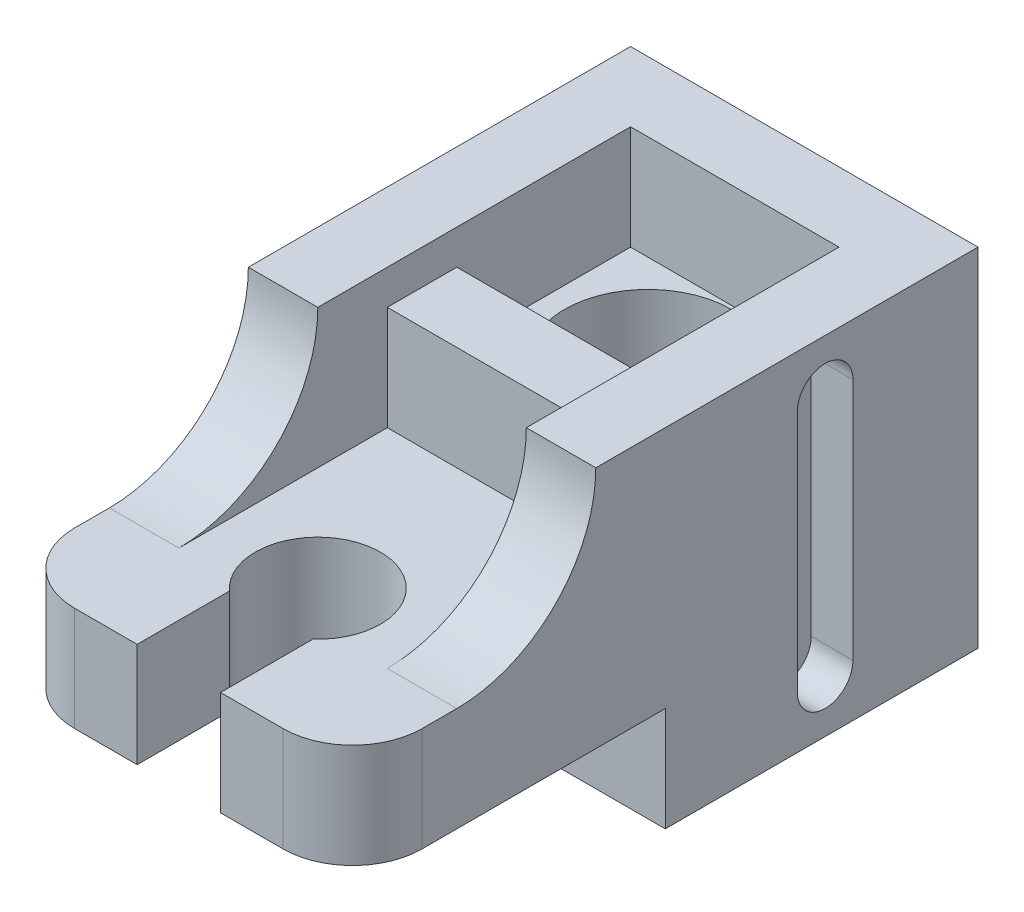
ISO-10303-21;
HEADER;
FILE_DESCRIPTION(('STEP AP214'),'2;1');
FILE_NAME('part.step','',(''),(''),'','','');
FILE_SCHEMA(('AUTOMOTIVE_DESIGN { 1 0 10303 214 1 1 1 1 }'));
ENDSEC;
DATA;
#1=APPLICATION_CONTEXT('core data for automotive mechanical design processes');
#2=APPLICATION_PROTOCOL_DEFINITION('international standard','automotive_design',2000,#1);
#3=PRODUCT_CONTEXT('',#1,'mechanical');
#4=PRODUCT('Part','Part','',(#3));
#5=PRODUCT_RELATED_PRODUCT_CATEGORY('part','',(#4));
#6=PRODUCT_DEFINITION_FORMATION('','',#4);
#7=PRODUCT_DEFINITION_CONTEXT('part definition',#1,'design');
#8=PRODUCT_DEFINITION('design','',#6,#7);
#9=PRODUCT_DEFINITION_SHAPE('','',#8);
#10=(LENGTH_UNIT() NAMED_UNIT(*) SI_UNIT(.MILLI.,.METRE.));
#11=(NAMED_UNIT(*) PLANE_ANGLE_UNIT() SI_UNIT($,.RADIAN.));
#12=(NAMED_UNIT(*) SI_UNIT($,.STERADIAN.) SOLID_ANGLE_UNIT());
#13=UNCERTAINTY_MEASURE_WITH_UNIT(LENGTH_MEASURE(1.E-05),#10,'distance_accuracy_value','');
#14=(GEOMETRIC_REPRESENTATION_CONTEXT(3) GLOBAL_UNCERTAINTY_ASSIGNED_CONTEXT((#13)) GLOBAL_UNIT_ASSIGNED_CONTEXT((#10,
#11,#12)) REPRESENTATION_CONTEXT('',''));
#15=CARTESIAN_POINT('',(0.,0.,0.));
#16=DIRECTION('',(0.,0.,1.));
#17=DIRECTION('',(1.,0.,0.));
#18=AXIS2_PLACEMENT_3D('',#15,#16,#17);
#19=CARTESIAN_POINT('',(-25.,50.,30.));
#20=DIRECTION('',(-1.,0.,0.));
#21=DIRECTION('',(0.,0.,1.));
#22=AXIS2_PLACEMENT_3D('',#19,#20,#21);
#23=PLANE('',#22);
#24=DIRECTION('',(0.,0.,-1.));
#25=VECTOR('',#24,1.);
#26=CARTESIAN_POINT('',(-25.,15.,45.));
#27=LINE('',#26,#25);
#28=CARTESIAN_POINT('',(-25.,15.,35.));
#29=VERTEX_POINT('',#28);
#30=CARTESIAN_POINT('',(-25.,15.,0.));
#31=VERTEX_POINT('',#30);
#32=EDGE_CURVE('E395',#29,#31,#27,.T.);
#33=ORIENTED_EDGE('',*,*,#32,.F.);
#34=DIRECTION('',(0.,-1.,0.));
#35=VECTOR('',#34,1.);
#36=CARTESIAN_POINT('',(-25.,30.,35.));
#37=LINE('',#36,#35);
#38=CARTESIAN_POINT('',(-25.,30.,35.));
#39=VERTEX_POINT('',#38);
#40=EDGE_CURVE('E11',#29,#39,#37,.F.);
#41=ORIENTED_EDGE('',*,*,#40,.T.);
#42=DIRECTION('',(0.,0.,1.));
#43=VECTOR('',#42,1.);
#44=CARTESIAN_POINT('',(-25.,30.,30.));
#45=LINE('',#44,#43);
#46=CARTESIAN_POINT('',(-25.,30.,30.));
#47=VERTEX_POINT('',#46);
#48=EDGE_CURVE('E421',#47,#39,#45,.T.);
#49=ORIENTED_EDGE('',*,*,#48,.F.);
#50=CARTESIAN_POINT('',(-25.,50.,30.));
#51=DIRECTION('',(-1.,0.,0.));
#52=DIRECTION('',(0.,0.,1.));
#53=AXIS2_PLACEMENT_3D('',#50,#51,#52);
#54=CIRCLE('',#53,20.);
#55=CARTESIAN_POINT('',(-25.,50.,10.));
#56=VERTEX_POINT('',#55);
#57=EDGE_CURVE('E418',#56,#47,#54,.T.);
#58=ORIENTED_EDGE('',*,*,#57,.F.);
#59=DIRECTION('',(0.,0.,1.));
#60=VECTOR('',#59,1.);
#61=CARTESIAN_POINT('',(-25.,50.,-45.));
#62=LINE('',#61,#60);
#63=CARTESIAN_POINT('',(-25.,50.,-45.));
#64=VERTEX_POINT('',#63);
#65=EDGE_CURVE('E415',#64,#56,#62,.T.);
#66=ORIENTED_EDGE('',*,*,#65,.F.);
#67=DIRECTION('',(0.,1.,0.));
#68=VECTOR('',#67,1.);
#69=CARTESIAN_POINT('',(-25.,0.,-45.));
#70=LINE('',#69,#68);
#71=CARTESIAN_POINT('',(-25.,0.,-45.));
#72=VERTEX_POINT('',#71);
#73=EDGE_CURVE('E413',#72,#64,#70,.T.);
#74=ORIENTED_EDGE('',*,*,#73,.F.);
#75=DIRECTION('',(0.,0.,-1.));
#76=VECTOR('',#75,1.);
#77=CARTESIAN_POINT('',(-25.,0.,0.));
#78=LINE('',#77,#76);
#79=CARTESIAN_POINT('',(-25.,0.,0.));
#80=VERTEX_POINT('',#79);
#81=EDGE_CURVE('E411',#80,#72,#78,.T.);
#82=ORIENTED_EDGE('',*,*,#81,.F.);
#83=DIRECTION('',(0.,-1.,0.));
#84=VECTOR('',#83,1.);
#85=CARTESIAN_POINT('',(-25.,15.,0.));
#86=LINE('',#85,#84);
#87=EDGE_CURVE('E381',#31,#80,#86,.T.);
#88=ORIENTED_EDGE('',*,*,#87,.F.);
#89=EDGE_LOOP('',(#33,#41,#49,#58,#66,#74,#82,#88));
#90=FACE_BOUND('',#89,.T.);
#91=DIRECTION('',(0.,1.,0.));
#92=VECTOR('',#91,1.);
#93=CARTESIAN_POINT('',(-25.,42.5,-27.));
#94=LINE('',#93,#92);
#95=CARTESIAN_POINT('',(-25.,7.5,-27.));
#96=VERTEX_POINT('',#95);
#97=CARTESIAN_POINT('',(-25.,42.5,-27.));
#98=VERTEX_POINT('',#97);
#99=EDGE_CURVE('E268',#96,#98,#94,.T.);
#100=ORIENTED_EDGE('',*,*,#99,.T.);
#101=CARTESIAN_POINT('',(-25.,42.5,-23.));
#102=DIRECTION('',(1.,0.,0.));
#103=DIRECTION('',(0.,0.,-1.));
#104=AXIS2_PLACEMENT_3D('',#101,#102,#103);
#105=CIRCLE('',#104,4.00000000000001);
#106=CARTESIAN_POINT('',(-25.,42.5,-19.));
#107=VERTEX_POINT('',#106);
#108=EDGE_CURVE('E255',#98,#107,#105,.T.);
#109=ORIENTED_EDGE('',*,*,#108,.T.);
#110=DIRECTION('',(0.,-1.,0.));
#111=VECTOR('',#110,1.);
#112=CARTESIAN_POINT('',(-25.,42.5,-19.));
#113=LINE('',#112,#111);
#114=CARTESIAN_POINT('',(-25.,7.5,-19.));
#115=VERTEX_POINT('',#114);
#116=EDGE_CURVE('E259',#107,#115,#113,.T.);
#117=ORIENTED_EDGE('',*,*,#116,.T.);
#118=CARTESIAN_POINT('',(-25.,7.5,-23.));
#119=DIRECTION('',(1.,0.,0.));
#120=DIRECTION('',(0.,0.,-1.));
#121=AXIS2_PLACEMENT_3D('',#118,#119,#120);
#122=CIRCLE('',#121,4.00000000000001);
#123=EDGE_CURVE('E262',#115,#96,#122,.T.);
#124=ORIENTED_EDGE('',*,*,#123,.T.);
#125=EDGE_LOOP('',(#100,#109,#117,#124));
#126=FACE_BOUND('',#125,.T.);
#127=ADVANCED_FACE('F37',(#90,#126),#23,.T.);
#128=CARTESIAN_POINT('',(25.,30.,45.));
#129=DIRECTION('',(0.,0.,-1.));
#130=DIRECTION('',(-1.,0.,0.));
#131=AXIS2_PLACEMENT_3D('',#128,#129,#130);
#132=PLANE('',#131);
#133=DIRECTION('',(-1.,0.,0.));
#134=VECTOR('',#133,1.);
#135=CARTESIAN_POINT('',(25.,30.,45.));
#136=LINE('',#135,#134);
#137=CARTESIAN_POINT('',(-6.,30.,45.));
#138=VERTEX_POINT('',#137);
#139=CARTESIAN_POINT('',(-15.,30.,45.));
#140=VERTEX_POINT('',#139);
#141=EDGE_CURVE('E429',#138,#140,#136,.T.);
#142=ORIENTED_EDGE('',*,*,#141,.T.);
#143=DIRECTION('',(0.,-1.,0.));
#144=VECTOR('',#143,1.);
#145=CARTESIAN_POINT('',(-15.,15.,45.));
#146=LINE('',#145,#144);
#147=CARTESIAN_POINT('',(-15.,15.,45.));
#148=VERTEX_POINT('',#147);
#149=EDGE_CURVE('E45',#140,#148,#146,.T.);
#150=ORIENTED_EDGE('',*,*,#149,.T.);
#151=DIRECTION('',(-1.,0.,0.));
#152=VECTOR('',#151,1.);
#153=CARTESIAN_POINT('',(25.,15.,45.));
#154=LINE('',#153,#152);
#155=CARTESIAN_POINT('',(-6.,15.,45.));
#156=VERTEX_POINT('',#155);
#157=EDGE_CURVE('E426',#156,#148,#154,.T.);
#158=ORIENTED_EDGE('',*,*,#157,.F.);
#159=DIRECTION('',(0.,-1.,0.));
#160=VECTOR('',#159,1.);
#161=CARTESIAN_POINT('',(-6.,50.,45.));
#162=LINE('',#161,#160);
#163=EDGE_CURVE('E317',#138,#156,#162,.T.);
#164=ORIENTED_EDGE('',*,*,#163,.F.);
#165=EDGE_LOOP('',(#142,#150,#158,#164));
#166=FACE_BOUND('',#165,.T.);
#167=ADVANCED_FACE('F474',(#166),#132,.F.);
#168=CARTESIAN_POINT('',(25.,50.,-45.));
#169=DIRECTION('',(0.,-1.,0.));
#170=DIRECTION('',(0.,0.,-1.));
#171=AXIS2_PLACEMENT_3D('',#168,#169,#170);
#172=PLANE('',#171);
#173=DIRECTION('',(0.,0.,1.));
#174=VECTOR('',#173,1.);
#175=CARTESIAN_POINT('',(-15.,50.,-35.));
#176=LINE('',#175,#174);
#177=CARTESIAN_POINT('',(-15.,50.,-35.));
#178=VERTEX_POINT('',#177);
#179=CARTESIAN_POINT('',(-15.,50.,10.));
#180=VERTEX_POINT('',#179);
#181=EDGE_CURVE('E332',#178,#180,#176,.T.);
#182=ORIENTED_EDGE('',*,*,#181,.F.);
#183=DIRECTION('',(1.,0.,0.));
#184=VECTOR('',#183,1.);
#185=CARTESIAN_POINT('',(-15.,50.,-35.));
#186=LINE('',#185,#184);
#187=CARTESIAN_POINT('',(15.,50.,-35.));
#188=VERTEX_POINT('',#187);
#189=EDGE_CURVE('E378',#178,#188,#186,.T.);
#190=ORIENTED_EDGE('',*,*,#189,.T.);
#191=DIRECTION('',(0.,0.,1.));
#192=VECTOR('',#191,1.);
#193=CARTESIAN_POINT('',(15.,50.,-35.));
#194=LINE('',#193,#192);
#195=CARTESIAN_POINT('',(15.,50.,10.));
#196=VERTEX_POINT('',#195);
#197=EDGE_CURVE('E331',#188,#196,#194,.T.);
#198=ORIENTED_EDGE('',*,*,#197,.T.);
#199=DIRECTION('',(-1.,0.,0.));
#200=VECTOR('',#199,1.);
#201=CARTESIAN_POINT('',(25.,50.,10.));
#202=LINE('',#201,#200);
#203=CARTESIAN_POINT('',(25.,50.,10.));
#204=VERTEX_POINT('',#203);
#205=EDGE_CURVE('E437',#204,#196,#202,.T.);
#206=ORIENTED_EDGE('',*,*,#205,.F.);
#207=DIRECTION('',(0.,0.,1.));
#208=VECTOR('',#207,1.);
#209=CARTESIAN_POINT('',(25.,50.,-45.));
#210=LINE('',#209,#208);
#211=CARTESIAN_POINT('',(25.,50.,-45.));
#212=VERTEX_POINT('',#211);
#213=EDGE_CURVE('E399',#212,#204,#210,.T.);
#214=ORIENTED_EDGE('',*,*,#213,.F.);
#215=DIRECTION('',(-1.,0.,0.));
#216=VECTOR('',#215,1.);
#217=CARTESIAN_POINT('',(25.,50.,-45.));
#218=LINE('',#217,#216);
#219=EDGE_CURVE('E440',#212,#64,#218,.T.);
#220=ORIENTED_EDGE('',*,*,#219,.T.);
#221=ORIENTED_EDGE('',*,*,#65,.T.);
#222=EDGE_CURVE('E436',#180,#56,#202,.T.);
#223=ORIENTED_EDGE('',*,*,#222,.F.);
#224=EDGE_LOOP('',(#182,#190,#198,#206,#214,#220,#221,#223));
#225=FACE_BOUND('',#224,.T.);
#226=ADVANCED_FACE('F542',(#225),#172,.F.);
#227=CARTESIAN_POINT('',(25.,50.,30.));
#228=DIRECTION('',(-1.,0.,0.));
#229=DIRECTION('',(0.,0.,1.));
#230=AXIS2_PLACEMENT_3D('',#227,#228,#229);
#231=CYLINDRICAL_SURFACE('',#230,20.);
#232=CARTESIAN_POINT('',(-15.,50.,30.));
#233=DIRECTION('',(-1.,0.,0.));
#234=DIRECTION('',(0.,0.,-1.));
#235=AXIS2_PLACEMENT_3D('',#232,#233,#234);
#236=CIRCLE('',#235,20.);
#237=CARTESIAN_POINT('',(-15.,30.,30.));
#238=VERTEX_POINT('',#237);
#239=EDGE_CURVE('E334',#180,#238,#236,.T.);
#240=ORIENTED_EDGE('',*,*,#239,.F.);
#241=ORIENTED_EDGE('',*,*,#222,.T.);
#242=ORIENTED_EDGE('',*,*,#57,.T.);
#243=DIRECTION('',(-1.,0.,0.));
#244=VECTOR('',#243,1.);
#245=CARTESIAN_POINT('',(25.,30.,30.));
#246=LINE('',#245,#244);
#247=EDGE_CURVE('E432',#238,#47,#246,.T.);
#248=ORIENTED_EDGE('',*,*,#247,.F.);
#249=EDGE_LOOP('',(#240,#241,#242,#248));
#250=FACE_BOUND('',#249,.T.);
#251=ADVANCED_FACE('F528',(#250),#231,.F.);
#252=CARTESIAN_POINT('',(25.,15.,0.));
#253=DIRECTION('',(0.,0.,-1.));
#254=DIRECTION('',(-1.,0.,0.));
#255=AXIS2_PLACEMENT_3D('',#252,#253,#254);
#256=PLANE('',#255);
#257=ORIENTED_EDGE('',*,*,#87,.T.);
#258=DIRECTION('',(-1.,0.,0.));
#259=VECTOR('',#258,1.);
#260=CARTESIAN_POINT('',(25.,0.,0.));
#261=LINE('',#260,#259);
#262=CARTESIAN_POINT('',(25.,0.,0.));
#263=VERTEX_POINT('',#262);
#264=EDGE_CURVE('E446',#263,#80,#261,.T.);
#265=ORIENTED_EDGE('',*,*,#264,.F.);
#266=DIRECTION('',(0.,-1.,0.));
#267=VECTOR('',#266,1.);
#268=CARTESIAN_POINT('',(25.,15.,0.));
#269=LINE('',#268,#267);
#270=CARTESIAN_POINT('',(25.,15.,0.));
#271=VERTEX_POINT('',#270);
#272=EDGE_CURVE('E391',#271,#263,#269,.T.);
#273=ORIENTED_EDGE('',*,*,#272,.F.);
#274=DIRECTION('',(-1.,0.,0.));
#275=VECTOR('',#274,1.);
#276=CARTESIAN_POINT('',(25.,15.,0.));
#277=LINE('',#276,#275);
#278=EDGE_CURVE('E408',#271,#31,#277,.T.);
#279=ORIENTED_EDGE('',*,*,#278,.T.);
#280=EDGE_LOOP('',(#257,#265,#273,#279));
#281=FACE_BOUND('',#280,.T.);
#282=ADVANCED_FACE('F564',(#281),#256,.F.);
#283=CARTESIAN_POINT('',(25.,0.,0.));
#284=DIRECTION('',(0.,1.,0.));
#285=DIRECTION('',(0.,0.,1.));
#286=AXIS2_PLACEMENT_3D('',#283,#284,#285);
#287=PLANE('',#286);
#288=CARTESIAN_POINT('',(0.,0.,-22.5));
#289=DIRECTION('',(0.,1.,0.));
#290=DIRECTION('',(0.,0.,1.));
#291=AXIS2_PLACEMENT_3D('',#288,#289,#290);
#292=CIRCLE('',#291,12.);
#293=CARTESIAN_POINT('',(0.,0.,-10.5));
#294=VERTEX_POINT('',#293);
#295=EDGE_CURVE('E310',#294,#294,#292,.T.);
#296=ORIENTED_EDGE('',*,*,#295,.T.);
#297=EDGE_LOOP('',(#296));
#298=FACE_BOUND('',#297,.T.);
#299=ORIENTED_EDGE('',*,*,#81,.T.);
#300=DIRECTION('',(-1.,0.,0.));
#301=VECTOR('',#300,1.);
#302=CARTESIAN_POINT('',(25.,0.,-45.));
#303=LINE('',#302,#301);
#304=CARTESIAN_POINT('',(25.,0.,-45.));
#305=VERTEX_POINT('',#304);
#306=EDGE_CURVE('E443',#305,#72,#303,.T.);
#307=ORIENTED_EDGE('',*,*,#306,.F.);
#308=DIRECTION('',(0.,0.,-1.));
#309=VECTOR('',#308,1.);
#310=CARTESIAN_POINT('',(25.,0.,0.));
#311=LINE('',#310,#309);
#312=EDGE_CURVE('E394',#263,#305,#311,.T.);
#313=ORIENTED_EDGE('',*,*,#312,.F.);
#314=ORIENTED_EDGE('',*,*,#264,.T.);
#315=EDGE_LOOP('',(#299,#307,#313,#314));
#316=FACE_BOUND('',#315,.T.);
#317=ADVANCED_FACE('F560',(#298,#316),#287,.F.);
#318=CARTESIAN_POINT('',(25.,0.,-45.));
#319=DIRECTION('',(0.,0.,1.));
#320=DIRECTION('',(1.,0.,0.));
#321=AXIS2_PLACEMENT_3D('',#318,#319,#320);
#322=PLANE('',#321);
#323=ORIENTED_EDGE('',*,*,#73,.T.);
#324=ORIENTED_EDGE('',*,*,#219,.F.);
#325=DIRECTION('',(0.,1.,0.));
#326=VECTOR('',#325,1.);
#327=CARTESIAN_POINT('',(25.,0.,-45.));
#328=LINE('',#327,#326);
#329=EDGE_CURVE('E397',#305,#212,#328,.T.);
#330=ORIENTED_EDGE('',*,*,#329,.F.);
#331=ORIENTED_EDGE('',*,*,#306,.T.);
#332=EDGE_LOOP('',(#323,#324,#330,#331));
#333=FACE_BOUND('',#332,.T.);
#334=ADVANCED_FACE('F554',(#333),#322,.F.);
#335=ORIENTED_EDGE('',*,*,#205,.T.);
#336=CARTESIAN_POINT('',(15.,50.,30.));
#337=DIRECTION('',(-1.,0.,0.));
#338=DIRECTION('',(0.,0.,-1.));
#339=AXIS2_PLACEMENT_3D('',#336,#337,#338);
#340=CIRCLE('',#339,20.);
#341=CARTESIAN_POINT('',(15.,30.,30.));
#342=VERTEX_POINT('',#341);
#343=EDGE_CURVE('E358',#196,#342,#340,.T.);
#344=ORIENTED_EDGE('',*,*,#343,.T.);
#345=CARTESIAN_POINT('',(25.,30.,30.));
#346=VERTEX_POINT('',#345);
#347=EDGE_CURVE('E433',#346,#342,#246,.T.);
#348=ORIENTED_EDGE('',*,*,#347,.F.);
#349=CARTESIAN_POINT('',(25.,50.,30.));
#350=DIRECTION('',(-1.,0.,0.));
#351=DIRECTION('',(0.,0.,1.));
#352=AXIS2_PLACEMENT_3D('',#349,#350,#351);
#353=CIRCLE('',#352,20.);
#354=EDGE_CURVE('E401',#204,#346,#353,.T.);
#355=ORIENTED_EDGE('',*,*,#354,.F.);
#356=EDGE_LOOP('',(#335,#344,#348,#355));
#357=FACE_BOUND('',#356,.T.);
#358=ADVANCED_FACE('F512',(#357),#231,.F.);
#359=CARTESIAN_POINT('',(25.,30.,30.));
#360=DIRECTION('',(0.,-1.,0.));
#361=DIRECTION('',(0.,0.,-1.));
#362=AXIS2_PLACEMENT_3D('',#359,#360,#361);
#363=PLANE('',#362);
#364=CARTESIAN_POINT('',(15.,30.,45.));
#365=VERTEX_POINT('',#364);
#366=CARTESIAN_POINT('',(6.,30.,45.));
#367=VERTEX_POINT('',#366);
#368=EDGE_CURVE('E430',#365,#367,#136,.T.);
#369=ORIENTED_EDGE('',*,*,#368,.F.);
#370=CARTESIAN_POINT('',(15.,30.,35.));
#371=DIRECTION('',(0.,-1.,0.));
#372=DIRECTION('',(0.,0.,-1.));
#373=AXIS2_PLACEMENT_3D('',#370,#371,#372);
#374=CIRCLE('',#373,10.);
#375=CARTESIAN_POINT('',(25.,30.,35.));
#376=VERTEX_POINT('',#375);
#377=EDGE_CURVE('E468',#365,#376,#374,.F.);
#378=ORIENTED_EDGE('',*,*,#377,.T.);
#379=DIRECTION('',(0.,0.,1.));
#380=VECTOR('',#379,1.);
#381=CARTESIAN_POINT('',(25.,30.,30.));
#382=LINE('',#381,#380);
#383=EDGE_CURVE('E403',#346,#376,#382,.T.);
#384=ORIENTED_EDGE('',*,*,#383,.F.);
#385=ORIENTED_EDGE('',*,*,#347,.T.);
#386=DIRECTION('',(0.,0.,-1.));
#387=VECTOR('',#386,1.);
#388=CARTESIAN_POINT('',(15.,30.,0.));
#389=LINE('',#388,#387);
#390=CARTESIAN_POINT('',(15.,30.,0.));
#391=VERTEX_POINT('',#390);
#392=EDGE_CURVE('E361',#342,#391,#389,.T.);
#393=ORIENTED_EDGE('',*,*,#392,.T.);
#394=DIRECTION('',(1.,0.,0.));
#395=VECTOR('',#394,1.);
#396=CARTESIAN_POINT('',(-15.,30.,0.));
#397=LINE('',#396,#395);
#398=CARTESIAN_POINT('',(-15.,30.,0.));
#399=VERTEX_POINT('',#398);
#400=EDGE_CURVE('E355',#399,#391,#397,.T.);
#401=ORIENTED_EDGE('',*,*,#400,.F.);
#402=DIRECTION('',(0.,0.,-1.));
#403=VECTOR('',#402,1.);
#404=CARTESIAN_POINT('',(-15.,30.,0.));
#405=LINE('',#404,#403);
#406=EDGE_CURVE('E337',#238,#399,#405,.T.);
#407=ORIENTED_EDGE('',*,*,#406,.F.);
#408=ORIENTED_EDGE('',*,*,#247,.T.);
#409=ORIENTED_EDGE('',*,*,#48,.T.);
#410=CARTESIAN_POINT('',(-15.,30.,35.));
#411=DIRECTION('',(0.,-1.,0.));
#412=DIRECTION('',(0.,0.,-1.));
#413=AXIS2_PLACEMENT_3D('',#410,#411,#412);
#414=CIRCLE('',#413,10.);
#415=EDGE_CURVE('E52',#39,#140,#414,.F.);
#416=ORIENTED_EDGE('',*,*,#415,.T.);
#417=ORIENTED_EDGE('',*,*,#141,.F.);
#418=DIRECTION('',(0.,0.,1.));
#419=VECTOR('',#418,1.);
#420=CARTESIAN_POINT('',(-6.,30.,30.));
#421=LINE('',#420,#419);
#422=CARTESIAN_POINT('',(-6.,30.,31.7082039324994));
#423=VERTEX_POINT('',#422);
#424=EDGE_CURVE('E324',#423,#138,#421,.T.);
#425=ORIENTED_EDGE('',*,*,#424,.F.);
#426=CARTESIAN_POINT('',(0.,30.,25.));
#427=DIRECTION('',(0.,-1.,0.));
#428=DIRECTION('',(0.,0.,-1.));
#429=AXIS2_PLACEMENT_3D('',#426,#427,#428);
#430=CIRCLE('',#429,9.);
#431=CARTESIAN_POINT('',(6.,30.,31.7082039324994));
#432=VERTEX_POINT('',#431);
#433=EDGE_CURVE('E326',#432,#423,#430,.F.);
#434=ORIENTED_EDGE('',*,*,#433,.F.);
#435=DIRECTION('',(0.,0.,1.));
#436=VECTOR('',#435,1.);
#437=CARTESIAN_POINT('',(6.,30.,30.));
#438=LINE('',#437,#436);
#439=EDGE_CURVE('E328',#432,#367,#438,.T.);
#440=ORIENTED_EDGE('',*,*,#439,.T.);
#441=EDGE_LOOP('',(#369,#378,#384,#385,#393,#401,#407,#408,#409,#416,#417,#425,#434,#440));
#442=FACE_BOUND('',#441,.T.);
#443=ADVANCED_FACE('F491',(#442),#363,.F.);
#444=CARTESIAN_POINT('',(15.,15.,45.));
#445=VERTEX_POINT('',#444);
#446=CARTESIAN_POINT('',(6.,15.,45.));
#447=VERTEX_POINT('',#446);
#448=EDGE_CURVE('E427',#445,#447,#154,.T.);
#449=ORIENTED_EDGE('',*,*,#448,.F.);
#450=DIRECTION('',(0.,-1.,0.));
#451=VECTOR('',#450,1.);
#452=CARTESIAN_POINT('',(15.,30.,45.));
#453=LINE('',#452,#451);
#454=EDGE_CURVE('E465',#445,#365,#453,.F.);
#455=ORIENTED_EDGE('',*,*,#454,.T.);
#456=ORIENTED_EDGE('',*,*,#368,.T.);
#457=DIRECTION('',(0.,-1.,0.));
#458=VECTOR('',#457,1.);
#459=CARTESIAN_POINT('',(6.,50.,45.));
#460=LINE('',#459,#458);
#461=EDGE_CURVE('E303',#367,#447,#460,.T.);
#462=ORIENTED_EDGE('',*,*,#461,.T.);
#463=EDGE_LOOP('',(#449,#455,#456,#462));
#464=FACE_BOUND('',#463,.T.);
#465=ADVANCED_FACE('F499',(#464),#132,.F.);
#466=CARTESIAN_POINT('',(25.,15.,45.));
#467=DIRECTION('',(0.,1.,0.));
#468=DIRECTION('',(0.,0.,1.));
#469=AXIS2_PLACEMENT_3D('',#466,#467,#468);
#470=PLANE('',#469);
#471=DIRECTION('',(0.,0.,-1.));
#472=VECTOR('',#471,1.);
#473=CARTESIAN_POINT('',(25.,15.,45.));
#474=LINE('',#473,#472);
#475=CARTESIAN_POINT('',(25.,15.,35.));
#476=VERTEX_POINT('',#475);
#477=EDGE_CURVE('E406',#476,#271,#474,.T.);
#478=ORIENTED_EDGE('',*,*,#477,.F.);
#479=CARTESIAN_POINT('',(15.,15.,35.));
#480=DIRECTION('',(0.,1.,0.));
#481=DIRECTION('',(0.,0.,1.));
#482=AXIS2_PLACEMENT_3D('',#479,#480,#481);
#483=CIRCLE('',#482,10.);
#484=EDGE_CURVE('E463',#476,#445,#483,.F.);
#485=ORIENTED_EDGE('',*,*,#484,.T.);
#486=ORIENTED_EDGE('',*,*,#448,.T.);
#487=DIRECTION('',(0.,0.,-1.));
#488=VECTOR('',#487,1.);
#489=CARTESIAN_POINT('',(6.,15.,45.));
#490=LINE('',#489,#488);
#491=CARTESIAN_POINT('',(6.,15.,31.7082039324994));
#492=VERTEX_POINT('',#491);
#493=EDGE_CURVE('E455',#447,#492,#490,.T.);
#494=ORIENTED_EDGE('',*,*,#493,.T.);
#495=CARTESIAN_POINT('',(0.,15.,25.));
#496=DIRECTION('',(0.,1.,0.));
#497=DIRECTION('',(0.,0.,1.));
#498=AXIS2_PLACEMENT_3D('',#495,#496,#497);
#499=CIRCLE('',#498,9.);
#500=CARTESIAN_POINT('',(-6.,15.,31.7082039324994));
#501=VERTEX_POINT('',#500);
#502=EDGE_CURVE('E453',#501,#492,#499,.F.);
#503=ORIENTED_EDGE('',*,*,#502,.F.);
#504=DIRECTION('',(0.,0.,-1.));
#505=VECTOR('',#504,1.);
#506=CARTESIAN_POINT('',(-6.,15.,45.));
#507=LINE('',#506,#505);
#508=EDGE_CURVE('E449',#156,#501,#507,.T.);
#509=ORIENTED_EDGE('',*,*,#508,.F.);
#510=ORIENTED_EDGE('',*,*,#157,.T.);
#511=CARTESIAN_POINT('',(-15.,15.,35.));
#512=DIRECTION('',(0.,1.,0.));
#513=DIRECTION('',(0.,0.,1.));
#514=AXIS2_PLACEMENT_3D('',#511,#512,#513);
#515=CIRCLE('',#514,10.);
#516=EDGE_CURVE('E461',#148,#29,#515,.F.);
#517=ORIENTED_EDGE('',*,*,#516,.T.);
#518=ORIENTED_EDGE('',*,*,#32,.T.);
#519=ORIENTED_EDGE('',*,*,#278,.F.);
#520=EDGE_LOOP('',(#478,#485,#486,#494,#503,#509,#510,#517,#518,#519));
#521=FACE_BOUND('',#520,.T.);
#522=ADVANCED_FACE('F480',(#521),#470,.F.);
#523=CARTESIAN_POINT('',(25.,50.,30.));
#524=DIRECTION('',(-1.,0.,0.));
#525=DIRECTION('',(0.,0.,1.));
#526=AXIS2_PLACEMENT_3D('',#523,#524,#525);
#527=PLANE('',#526);
#528=DIRECTION('',(0.,-1.,0.));
#529=VECTOR('',#528,1.);
#530=CARTESIAN_POINT('',(25.,42.5,-19.));
#531=LINE('',#530,#529);
#532=CARTESIAN_POINT('',(25.,42.5,-19.));
#533=VERTEX_POINT('',#532);
#534=CARTESIAN_POINT('',(25.,7.5,-19.));
#535=VERTEX_POINT('',#534);
#536=EDGE_CURVE('E293',#533,#535,#531,.T.);
#537=ORIENTED_EDGE('',*,*,#536,.F.);
#538=CARTESIAN_POINT('',(25.,42.5,-23.));
#539=DIRECTION('',(1.,0.,0.));
#540=DIRECTION('',(0.,0.,-1.));
#541=AXIS2_PLACEMENT_3D('',#538,#539,#540);
#542=CIRCLE('',#541,4.00000000000001);
#543=CARTESIAN_POINT('',(25.,42.5,-27.));
#544=VERTEX_POINT('',#543);
#545=EDGE_CURVE('E274',#544,#533,#542,.T.);
#546=ORIENTED_EDGE('',*,*,#545,.F.);
#547=DIRECTION('',(0.,1.,0.));
#548=VECTOR('',#547,1.);
#549=CARTESIAN_POINT('',(25.,42.5,-27.));
#550=LINE('',#549,#548);
#551=CARTESIAN_POINT('',(25.,7.5,-27.));
#552=VERTEX_POINT('',#551);
#553=EDGE_CURVE('E282',#552,#544,#550,.T.);
#554=ORIENTED_EDGE('',*,*,#553,.F.);
#555=CARTESIAN_POINT('',(25.,7.5,-23.));
#556=DIRECTION('',(1.,0.,0.));
#557=DIRECTION('',(0.,0.,-1.));
#558=AXIS2_PLACEMENT_3D('',#555,#556,#557);
#559=CIRCLE('',#558,4.00000000000001);
#560=EDGE_CURVE('E296',#535,#552,#559,.T.);
#561=ORIENTED_EDGE('',*,*,#560,.F.);
#562=EDGE_LOOP('',(#537,#546,#554,#561));
#563=FACE_BOUND('',#562,.T.);
#564=ORIENTED_EDGE('',*,*,#383,.T.);
#565=DIRECTION('',(0.,-1.,0.));
#566=VECTOR('',#565,1.);
#567=CARTESIAN_POINT('',(25.,50.,35.));
#568=LINE('',#567,#566);
#569=EDGE_CURVE('E458',#376,#476,#568,.T.);
#570=ORIENTED_EDGE('',*,*,#569,.T.);
#571=ORIENTED_EDGE('',*,*,#477,.T.);
#572=ORIENTED_EDGE('',*,*,#272,.T.);
#573=ORIENTED_EDGE('',*,*,#312,.T.);
#574=ORIENTED_EDGE('',*,*,#329,.T.);
#575=ORIENTED_EDGE('',*,*,#213,.T.);
#576=ORIENTED_EDGE('',*,*,#354,.T.);
#577=EDGE_LOOP('',(#564,#570,#571,#572,#573,#574,#575,#576));
#578=FACE_BOUND('',#577,.T.);
#579=ADVANCED_FACE('F506',(#563,#578),#527,.F.);
#580=CARTESIAN_POINT('',(-15.,50.,-35.));
#581=DIRECTION('',(0.,0.,-1.));
#582=DIRECTION('',(-1.,0.,0.));
#583=AXIS2_PLACEMENT_3D('',#580,#581,#582);
#584=PLANE('',#583);
#585=DIRECTION('',(0.,1.,0.));
#586=VECTOR('',#585,1.);
#587=CARTESIAN_POINT('',(15.,50.,-35.));
#588=LINE('',#587,#586);
#589=CARTESIAN_POINT('',(15.,35.,-35.));
#590=VERTEX_POINT('',#589);
#591=EDGE_CURVE('E335',#590,#188,#588,.T.);
#592=ORIENTED_EDGE('',*,*,#591,.T.);
#593=ORIENTED_EDGE('',*,*,#189,.F.);
#594=DIRECTION('',(0.,1.,0.));
#595=VECTOR('',#594,1.);
#596=CARTESIAN_POINT('',(-15.,50.,-35.));
#597=LINE('',#596,#595);
#598=CARTESIAN_POINT('',(-15.,35.,-35.));
#599=VERTEX_POINT('',#598);
#600=EDGE_CURVE('E352',#599,#178,#597,.T.);
#601=ORIENTED_EDGE('',*,*,#600,.F.);
#602=DIRECTION('',(1.,0.,0.));
#603=VECTOR('',#602,1.);
#604=CARTESIAN_POINT('',(-15.,35.,-35.));
#605=LINE('',#604,#603);
#606=EDGE_CURVE('E382',#599,#590,#605,.T.);
#607=ORIENTED_EDGE('',*,*,#606,.T.);
#608=EDGE_LOOP('',(#592,#593,#601,#607));
#609=FACE_BOUND('',#608,.T.);
#610=ADVANCED_FACE('F584',(#609),#584,.F.);
#611=CARTESIAN_POINT('',(-15.,35.,-35.));
#612=DIRECTION('',(0.,-1.,0.));
#613=DIRECTION('',(0.,0.,-1.));
#614=AXIS2_PLACEMENT_3D('',#611,#612,#613);
#615=PLANE('',#614);
#616=CARTESIAN_POINT('',(0.,35.,-22.5));
#617=DIRECTION('',(0.,-1.,0.));
#618=DIRECTION('',(0.,0.,-1.));
#619=AXIS2_PLACEMENT_3D('',#616,#617,#618);
#620=CIRCLE('',#619,12.);
#621=CARTESIAN_POINT('',(0.,35.,-34.5));
#622=VERTEX_POINT('',#621);
#623=EDGE_CURVE('E313',#622,#622,#620,.F.);
#624=ORIENTED_EDGE('',*,*,#623,.F.);
#625=EDGE_LOOP('',(#624));
#626=FACE_BOUND('',#625,.T.);
#627=DIRECTION('',(0.,0.,-1.));
#628=VECTOR('',#627,1.);
#629=CARTESIAN_POINT('',(15.,35.,-35.));
#630=LINE('',#629,#628);
#631=CARTESIAN_POINT('',(15.,35.,-9.99999999999999));
#632=VERTEX_POINT('',#631);
#633=EDGE_CURVE('E373',#632,#590,#630,.T.);
#634=ORIENTED_EDGE('',*,*,#633,.T.);
#635=ORIENTED_EDGE('',*,*,#606,.F.);
#636=DIRECTION('',(0.,0.,-1.));
#637=VECTOR('',#636,1.);
#638=CARTESIAN_POINT('',(-15.,35.,-35.));
#639=LINE('',#638,#637);
#640=CARTESIAN_POINT('',(-15.,35.,-9.99999999999999));
#641=VERTEX_POINT('',#640);
#642=EDGE_CURVE('E349',#641,#599,#639,.T.);
#643=ORIENTED_EDGE('',*,*,#642,.F.);
#644=DIRECTION('',(1.,0.,0.));
#645=VECTOR('',#644,1.);
#646=CARTESIAN_POINT('',(-15.,35.,-9.99999999999999));
#647=LINE('',#646,#645);
#648=EDGE_CURVE('E384',#641,#632,#647,.T.);
#649=ORIENTED_EDGE('',*,*,#648,.T.);
#650=EDGE_LOOP('',(#634,#635,#643,#649));
#651=FACE_BOUND('',#650,.T.);
#652=ADVANCED_FACE('F588',(#626,#651),#615,.F.);
#653=CARTESIAN_POINT('',(-15.,35.,-9.99999999999999));
#654=DIRECTION('',(0.,0.,1.));
#655=DIRECTION('',(1.,0.,0.));
#656=AXIS2_PLACEMENT_3D('',#653,#654,#655);
#657=PLANE('',#656);
#658=DIRECTION('',(0.,-1.,0.));
#659=VECTOR('',#658,1.);
#660=CARTESIAN_POINT('',(15.,35.,-9.99999999999999));
#661=LINE('',#660,#659);
#662=CARTESIAN_POINT('',(15.,45.,-9.99999999999999));
#663=VERTEX_POINT('',#662);
#664=EDGE_CURVE('E370',#663,#632,#661,.T.);
#665=ORIENTED_EDGE('',*,*,#664,.T.);
#666=ORIENTED_EDGE('',*,*,#648,.F.);
#667=DIRECTION('',(0.,-1.,0.));
#668=VECTOR('',#667,1.);
#669=CARTESIAN_POINT('',(-15.,35.,-9.99999999999999));
#670=LINE('',#669,#668);
#671=CARTESIAN_POINT('',(-15.,45.,-9.99999999999999));
#672=VERTEX_POINT('',#671);
#673=EDGE_CURVE('E346',#672,#641,#670,.T.);
#674=ORIENTED_EDGE('',*,*,#673,.F.);
#675=DIRECTION('',(1.,0.,0.));
#676=VECTOR('',#675,1.);
#677=CARTESIAN_POINT('',(-15.,45.,-9.99999999999999));
#678=LINE('',#677,#676);
#679=EDGE_CURVE('E386',#672,#663,#678,.T.);
#680=ORIENTED_EDGE('',*,*,#679,.T.);
#681=EDGE_LOOP('',(#665,#666,#674,#680));
#682=FACE_BOUND('',#681,.T.);
#683=ADVANCED_FACE('F590',(#682),#657,.F.);
#684=CARTESIAN_POINT('',(-15.,45.,-9.99999999999999));
#685=DIRECTION('',(0.,-1.,0.));
#686=DIRECTION('',(0.,0.,-1.));
#687=AXIS2_PLACEMENT_3D('',#684,#685,#686);
#688=PLANE('',#687);
#689=DIRECTION('',(0.,0.,-1.));
#690=VECTOR('',#689,1.);
#691=CARTESIAN_POINT('',(15.,45.,-9.99999999999999));
#692=LINE('',#691,#690);
#693=CARTESIAN_POINT('',(15.,45.,0.));
#694=VERTEX_POINT('',#693);
#695=EDGE_CURVE('E367',#694,#663,#692,.T.);
#696=ORIENTED_EDGE('',*,*,#695,.T.);
#697=ORIENTED_EDGE('',*,*,#679,.F.);
#698=DIRECTION('',(0.,0.,-1.));
#699=VECTOR('',#698,1.);
#700=CARTESIAN_POINT('',(-15.,45.,-9.99999999999999));
#701=LINE('',#700,#699);
#702=CARTESIAN_POINT('',(-15.,45.,0.));
#703=VERTEX_POINT('',#702);
#704=EDGE_CURVE('E343',#703,#672,#701,.T.);
#705=ORIENTED_EDGE('',*,*,#704,.F.);
#706=DIRECTION('',(1.,0.,0.));
#707=VECTOR('',#706,1.);
#708=CARTESIAN_POINT('',(-15.,45.,0.));
#709=LINE('',#708,#707);
#710=EDGE_CURVE('E388',#703,#694,#709,.T.);
#711=ORIENTED_EDGE('',*,*,#710,.T.);
#712=EDGE_LOOP('',(#696,#697,#705,#711));
#713=FACE_BOUND('',#712,.T.);
#714=ADVANCED_FACE('F593',(#713),#688,.F.);
#715=CARTESIAN_POINT('',(-15.,45.,0.));
#716=DIRECTION('',(0.,0.,-1.));
#717=DIRECTION('',(0.,1.,0.));
#718=AXIS2_PLACEMENT_3D('',#715,#716,#717);
#719=PLANE('',#718);
#720=DIRECTION('',(0.,1.,0.));
#721=VECTOR('',#720,1.);
#722=CARTESIAN_POINT('',(15.,45.,0.));
#723=LINE('',#722,#721);
#724=EDGE_CURVE('E364',#391,#694,#723,.T.);
#725=ORIENTED_EDGE('',*,*,#724,.T.);
#726=ORIENTED_EDGE('',*,*,#710,.F.);
#727=DIRECTION('',(0.,1.,0.));
#728=VECTOR('',#727,1.);
#729=CARTESIAN_POINT('',(-15.,45.,0.));
#730=LINE('',#729,#728);
#731=EDGE_CURVE('E340',#399,#703,#730,.T.);
#732=ORIENTED_EDGE('',*,*,#731,.F.);
#733=ORIENTED_EDGE('',*,*,#400,.T.);
#734=EDGE_LOOP('',(#725,#726,#732,#733));
#735=FACE_BOUND('',#734,.T.);
#736=ADVANCED_FACE('F521',(#735),#719,.F.);
#737=CARTESIAN_POINT('',(-15.,50.,30.));
#738=DIRECTION('',(1.,0.,0.));
#739=DIRECTION('',(0.,0.,-1.));
#740=AXIS2_PLACEMENT_3D('',#737,#738,#739);
#741=PLANE('',#740);
#742=ORIENTED_EDGE('',*,*,#181,.T.);
#743=ORIENTED_EDGE('',*,*,#239,.T.);
#744=ORIENTED_EDGE('',*,*,#406,.T.);
#745=ORIENTED_EDGE('',*,*,#731,.T.);
#746=ORIENTED_EDGE('',*,*,#704,.T.);
#747=ORIENTED_EDGE('',*,*,#673,.T.);
#748=ORIENTED_EDGE('',*,*,#642,.T.);
#749=ORIENTED_EDGE('',*,*,#600,.T.);
#750=EDGE_LOOP('',(#742,#743,#744,#745,#746,#747,#748,#749));
#751=FACE_BOUND('',#750,.T.);
#752=ADVANCED_FACE('F524',(#751),#741,.T.);
#753=CARTESIAN_POINT('',(15.,50.,30.));
#754=DIRECTION('',(1.,0.,0.));
#755=DIRECTION('',(0.,0.,-1.));
#756=AXIS2_PLACEMENT_3D('',#753,#754,#755);
#757=PLANE('',#756);
#758=ORIENTED_EDGE('',*,*,#197,.F.);
#759=ORIENTED_EDGE('',*,*,#591,.F.);
#760=ORIENTED_EDGE('',*,*,#633,.F.);
#761=ORIENTED_EDGE('',*,*,#664,.F.);
#762=ORIENTED_EDGE('',*,*,#695,.F.);
#763=ORIENTED_EDGE('',*,*,#724,.F.);
#764=ORIENTED_EDGE('',*,*,#392,.F.);
#765=ORIENTED_EDGE('',*,*,#343,.F.);
#766=EDGE_LOOP('',(#758,#759,#760,#761,#762,#763,#764,#765));
#767=FACE_BOUND('',#766,.T.);
#768=ADVANCED_FACE('F517',(#767),#757,.F.);
#769=CARTESIAN_POINT('',(0.,50.,-22.5));
#770=DIRECTION('',(0.,-1.,0.));
#771=DIRECTION('',(0.,0.,-1.));
#772=AXIS2_PLACEMENT_3D('',#769,#770,#771);
#773=CYLINDRICAL_SURFACE('',#772,12.);
#774=ORIENTED_EDGE('',*,*,#295,.F.);
#775=EDGE_LOOP('',(#774));
#776=FACE_BOUND('',#775,.T.);
#777=ORIENTED_EDGE('',*,*,#623,.T.);
#778=EDGE_LOOP('',(#777));
#779=FACE_BOUND('',#778,.T.);
#780=ADVANCED_FACE('F609',(#776,#779),#773,.F.);
#781=CARTESIAN_POINT('',(6.00000000000001,50.,0.));
#782=DIRECTION('',(1.,0.,0.));
#783=DIRECTION('',(0.,0.,-1.));
#784=AXIS2_PLACEMENT_3D('',#781,#782,#783);
#785=PLANE('',#784);
#786=DIRECTION('',(0.,-1.,0.));
#787=VECTOR('',#786,1.);
#788=CARTESIAN_POINT('',(6.,50.,31.7082039324994));
#789=LINE('',#788,#787);
#790=EDGE_CURVE('E314',#432,#492,#789,.T.);
#791=ORIENTED_EDGE('',*,*,#790,.T.);
#792=ORIENTED_EDGE('',*,*,#493,.F.);
#793=ORIENTED_EDGE('',*,*,#461,.F.);
#794=ORIENTED_EDGE('',*,*,#439,.F.);
#795=EDGE_LOOP('',(#791,#792,#793,#794));
#796=FACE_BOUND('',#795,.T.);
#797=ADVANCED_FACE('F495',(#796),#785,.F.);
#798=CARTESIAN_POINT('',(0.,50.,25.));
#799=DIRECTION('',(0.,-1.,0.));
#800=DIRECTION('',(0.,0.,-1.));
#801=AXIS2_PLACEMENT_3D('',#798,#799,#800);
#802=CYLINDRICAL_SURFACE('',#801,9.);
#803=ORIENTED_EDGE('',*,*,#433,.T.);
#804=DIRECTION('',(0.,-1.,0.));
#805=VECTOR('',#804,1.);
#806=CARTESIAN_POINT('',(-6.,50.,31.7082039324994));
#807=LINE('',#806,#805);
#808=EDGE_CURVE('E319',#423,#501,#807,.T.);
#809=ORIENTED_EDGE('',*,*,#808,.T.);
#810=ORIENTED_EDGE('',*,*,#502,.T.);
#811=ORIENTED_EDGE('',*,*,#790,.F.);
#812=EDGE_LOOP('',(#803,#809,#810,#811));
#813=FACE_BOUND('',#812,.T.);
#814=ADVANCED_FACE('F487',(#813),#802,.F.);
#815=CARTESIAN_POINT('',(-6.00000000000001,50.,0.));
#816=DIRECTION('',(1.,0.,0.));
#817=DIRECTION('',(0.,0.,-1.));
#818=AXIS2_PLACEMENT_3D('',#815,#816,#817);
#819=PLANE('',#818);
#820=ORIENTED_EDGE('',*,*,#424,.T.);
#821=ORIENTED_EDGE('',*,*,#163,.T.);
#822=ORIENTED_EDGE('',*,*,#508,.T.);
#823=ORIENTED_EDGE('',*,*,#808,.F.);
#824=EDGE_LOOP('',(#820,#821,#822,#823));
#825=FACE_BOUND('',#824,.T.);
#826=ADVANCED_FACE('F484',(#825),#819,.T.);
#827=CARTESIAN_POINT('',(19.,42.5,-23.));
#828=DIRECTION('',(1.,0.,0.));
#829=DIRECTION('',(0.,0.,-1.));
#830=AXIS2_PLACEMENT_3D('',#827,#828,#829);
#831=CYLINDRICAL_SURFACE('',#830,4.00000000000001);
#832=ORIENTED_EDGE('',*,*,#545,.T.);
#833=DIRECTION('',(1.,0.,0.));
#834=VECTOR('',#833,1.);
#835=CARTESIAN_POINT('',(19.,42.5,-19.));
#836=LINE('',#835,#834);
#837=CARTESIAN_POINT('',(19.,42.5,-19.));
#838=VERTEX_POINT('',#837);
#839=EDGE_CURVE('E291',#838,#533,#836,.T.);
#840=ORIENTED_EDGE('',*,*,#839,.F.);
#841=CARTESIAN_POINT('',(19.,42.5,-23.));
#842=DIRECTION('',(1.,0.,0.));
#843=DIRECTION('',(0.,0.,-1.));
#844=AXIS2_PLACEMENT_3D('',#841,#842,#843);
#845=CIRCLE('',#844,4.00000000000001);
#846=CARTESIAN_POINT('',(19.,42.5,-27.));
#847=VERTEX_POINT('',#846);
#848=EDGE_CURVE('E278',#847,#838,#845,.T.);
#849=ORIENTED_EDGE('',*,*,#848,.F.);
#850=DIRECTION('',(1.,0.,0.));
#851=VECTOR('',#850,1.);
#852=CARTESIAN_POINT('',(19.,42.5,-27.));
#853=LINE('',#852,#851);
#854=EDGE_CURVE('E301',#847,#544,#853,.T.);
#855=ORIENTED_EDGE('',*,*,#854,.T.);
#856=EDGE_LOOP('',(#832,#840,#849,#855));
#857=FACE_BOUND('',#856,.T.);
#858=ADVANCED_FACE('F618',(#857),#831,.F.);
#859=CARTESIAN_POINT('',(19.,42.5,-27.));
#860=DIRECTION('',(0.,0.,-1.));
#861=DIRECTION('',(-1.,0.,0.));
#862=AXIS2_PLACEMENT_3D('',#859,#860,#861);
#863=PLANE('',#862);
#864=ORIENTED_EDGE('',*,*,#553,.T.);
#865=ORIENTED_EDGE('',*,*,#854,.F.);
#866=DIRECTION('',(0.,1.,0.));
#867=VECTOR('',#866,1.);
#868=CARTESIAN_POINT('',(19.,42.5,-27.));
#869=LINE('',#868,#867);
#870=CARTESIAN_POINT('',(19.,7.5,-27.));
#871=VERTEX_POINT('',#870);
#872=EDGE_CURVE('E288',#871,#847,#869,.T.);
#873=ORIENTED_EDGE('',*,*,#872,.F.);
#874=DIRECTION('',(1.,0.,0.));
#875=VECTOR('',#874,1.);
#876=CARTESIAN_POINT('',(19.,7.5,-27.));
#877=LINE('',#876,#875);
#878=EDGE_CURVE('E304',#871,#552,#877,.T.);
#879=ORIENTED_EDGE('',*,*,#878,.T.);
#880=EDGE_LOOP('',(#864,#865,#873,#879));
#881=FACE_BOUND('',#880,.T.);
#882=ADVANCED_FACE('F624',(#881),#863,.F.);
#883=CARTESIAN_POINT('',(19.,7.5,-23.));
#884=DIRECTION('',(1.,0.,0.));
#885=DIRECTION('',(0.,0.,-1.));
#886=AXIS2_PLACEMENT_3D('',#883,#884,#885);
#887=CYLINDRICAL_SURFACE('',#886,4.00000000000001);
#888=ORIENTED_EDGE('',*,*,#560,.T.);
#889=ORIENTED_EDGE('',*,*,#878,.F.);
#890=CARTESIAN_POINT('',(19.,7.5,-23.));
#891=DIRECTION('',(1.,0.,0.));
#892=DIRECTION('',(0.,0.,-1.));
#893=AXIS2_PLACEMENT_3D('',#890,#891,#892);
#894=CIRCLE('',#893,4.00000000000001);
#895=CARTESIAN_POINT('',(19.,7.5,-19.));
#896=VERTEX_POINT('',#895);
#897=EDGE_CURVE('E285',#896,#871,#894,.T.);
#898=ORIENTED_EDGE('',*,*,#897,.F.);
#899=DIRECTION('',(1.,0.,0.));
#900=VECTOR('',#899,1.);
#901=CARTESIAN_POINT('',(19.,7.5,-19.));
#902=LINE('',#901,#900);
#903=EDGE_CURVE('E306',#896,#535,#902,.T.);
#904=ORIENTED_EDGE('',*,*,#903,.T.);
#905=EDGE_LOOP('',(#888,#889,#898,#904));
#906=FACE_BOUND('',#905,.T.);
#907=ADVANCED_FACE('F630',(#906),#887,.F.);
#908=CARTESIAN_POINT('',(19.,42.5,-19.));
#909=DIRECTION('',(0.,0.,1.));
#910=DIRECTION('',(1.,0.,0.));
#911=AXIS2_PLACEMENT_3D('',#908,#909,#910);
#912=PLANE('',#911);
#913=ORIENTED_EDGE('',*,*,#536,.T.);
#914=ORIENTED_EDGE('',*,*,#903,.F.);
#915=DIRECTION('',(0.,-1.,0.));
#916=VECTOR('',#915,1.);
#917=CARTESIAN_POINT('',(19.,42.5,-19.));
#918=LINE('',#917,#916);
#919=EDGE_CURVE('E281',#838,#896,#918,.T.);
#920=ORIENTED_EDGE('',*,*,#919,.F.);
#921=ORIENTED_EDGE('',*,*,#839,.T.);
#922=EDGE_LOOP('',(#913,#914,#920,#921));
#923=FACE_BOUND('',#922,.T.);
#924=ADVANCED_FACE('F626',(#923),#912,.F.);
#925=CARTESIAN_POINT('',(19.,42.5,-23.));
#926=DIRECTION('',(1.,0.,0.));
#927=DIRECTION('',(0.,0.,-1.));
#928=AXIS2_PLACEMENT_3D('',#925,#926,#927);
#929=PLANE('',#928);
#930=ORIENTED_EDGE('',*,*,#848,.T.);
#931=ORIENTED_EDGE('',*,*,#919,.T.);
#932=ORIENTED_EDGE('',*,*,#897,.T.);
#933=ORIENTED_EDGE('',*,*,#872,.T.);
#934=EDGE_LOOP('',(#930,#931,#932,#933));
#935=FACE_BOUND('',#934,.T.);
#936=ADVANCED_FACE('F629',(#935),#929,.T.);
#937=CARTESIAN_POINT('',(-19.,42.5,-23.));
#938=DIRECTION('',(-1.,0.,0.));
#939=DIRECTION('',(0.,0.,1.));
#940=AXIS2_PLACEMENT_3D('',#937,#938,#939);
#941=CYLINDRICAL_SURFACE('',#940,4.00000000000001);
#942=ORIENTED_EDGE('',*,*,#108,.F.);
#943=DIRECTION('',(-1.,0.,0.));
#944=VECTOR('',#943,1.);
#945=CARTESIAN_POINT('',(-19.,42.5,-27.));
#946=LINE('',#945,#944);
#947=CARTESIAN_POINT('',(-19.,42.5,-27.));
#948=VERTEX_POINT('',#947);
#949=EDGE_CURVE('E240',#948,#98,#946,.T.);
#950=ORIENTED_EDGE('',*,*,#949,.F.);
#951=CARTESIAN_POINT('',(-19.,42.5,-23.));
#952=DIRECTION('',(1.,0.,0.));
#953=DIRECTION('',(0.,0.,-1.));
#954=AXIS2_PLACEMENT_3D('',#951,#952,#953);
#955=CIRCLE('',#954,4.00000000000001);
#956=CARTESIAN_POINT('',(-19.,42.5,-19.));
#957=VERTEX_POINT('',#956);
#958=EDGE_CURVE('E247',#948,#957,#955,.T.);
#959=ORIENTED_EDGE('',*,*,#958,.T.);
#960=DIRECTION('',(-1.,0.,0.));
#961=VECTOR('',#960,1.);
#962=CARTESIAN_POINT('',(-19.,42.5,-19.));
#963=LINE('',#962,#961);
#964=EDGE_CURVE('E272',#957,#107,#963,.T.);
#965=ORIENTED_EDGE('',*,*,#964,.T.);
#966=EDGE_LOOP('',(#942,#950,#959,#965));
#967=FACE_BOUND('',#966,.T.);
#968=ADVANCED_FACE('F251',(#967),#941,.F.);
#969=CARTESIAN_POINT('',(-19.,42.5,-19.));
#970=DIRECTION('',(0.,0.,-1.));
#971=DIRECTION('',(-1.,0.,0.));
#972=AXIS2_PLACEMENT_3D('',#969,#970,#971);
#973=PLANE('',#972);
#974=ORIENTED_EDGE('',*,*,#116,.F.);
#975=ORIENTED_EDGE('',*,*,#964,.F.);
#976=DIRECTION('',(0.,-1.,0.));
#977=VECTOR('',#976,1.);
#978=CARTESIAN_POINT('',(-19.,42.5,-19.));
#979=LINE('',#978,#977);
#980=CARTESIAN_POINT('',(-19.,7.5,-19.));
#981=VERTEX_POINT('',#980);
#982=EDGE_CURVE('E256',#957,#981,#979,.T.);
#983=ORIENTED_EDGE('',*,*,#982,.T.);
#984=DIRECTION('',(-1.,0.,0.));
#985=VECTOR('',#984,1.);
#986=CARTESIAN_POINT('',(-19.,7.5,-19.));
#987=LINE('',#986,#985);
#988=EDGE_CURVE('E275',#981,#115,#987,.T.);
#989=ORIENTED_EDGE('',*,*,#988,.T.);
#990=EDGE_LOOP('',(#974,#975,#983,#989));
#991=FACE_BOUND('',#990,.T.);
#992=ADVANCED_FACE('F643',(#991),#973,.T.);
#993=CARTESIAN_POINT('',(-19.,7.5,-23.));
#994=DIRECTION('',(-1.,0.,0.));
#995=DIRECTION('',(0.,0.,1.));
#996=AXIS2_PLACEMENT_3D('',#993,#994,#995);
#997=CYLINDRICAL_SURFACE('',#996,4.00000000000001);
#998=ORIENTED_EDGE('',*,*,#123,.F.);
#999=ORIENTED_EDGE('',*,*,#988,.F.);
#1000=CARTESIAN_POINT('',(-19.,7.5,-23.));
#1001=DIRECTION('',(1.,0.,0.));
#1002=DIRECTION('',(0.,0.,-1.));
#1003=AXIS2_PLACEMENT_3D('',#1000,#1001,#1002);
#1004=CIRCLE('',#1003,4.00000000000001);
#1005=CARTESIAN_POINT('',(-19.,7.5,-27.));
#1006=VERTEX_POINT('',#1005);
#1007=EDGE_CURVE('E246',#981,#1006,#1004,.T.);
#1008=ORIENTED_EDGE('',*,*,#1007,.T.);
#1009=DIRECTION('',(-1.,0.,0.));
#1010=VECTOR('',#1009,1.);
#1011=CARTESIAN_POINT('',(-19.,7.5,-27.));
#1012=LINE('',#1011,#1010);
#1013=EDGE_CURVE('E242',#1006,#96,#1012,.T.);
#1014=ORIENTED_EDGE('',*,*,#1013,.T.);
#1015=EDGE_LOOP('',(#998,#999,#1008,#1014));
#1016=FACE_BOUND('',#1015,.T.);
#1017=ADVANCED_FACE('F646',(#1016),#997,.F.);
#1018=CARTESIAN_POINT('',(-19.,42.5,-27.));
#1019=DIRECTION('',(0.,0.,1.));
#1020=DIRECTION('',(1.,0.,0.));
#1021=AXIS2_PLACEMENT_3D('',#1018,#1019,#1020);
#1022=PLANE('',#1021);
#1023=ORIENTED_EDGE('',*,*,#99,.F.);
#1024=ORIENTED_EDGE('',*,*,#1013,.F.);
#1025=DIRECTION('',(0.,1.,0.));
#1026=VECTOR('',#1025,1.);
#1027=CARTESIAN_POINT('',(-19.,42.5,-27.));
#1028=LINE('',#1027,#1026);
#1029=EDGE_CURVE('E236',#1006,#948,#1028,.T.);
#1030=ORIENTED_EDGE('',*,*,#1029,.T.);
#1031=ORIENTED_EDGE('',*,*,#949,.T.);
#1032=EDGE_LOOP('',(#1023,#1024,#1030,#1031));
#1033=FACE_BOUND('',#1032,.T.);
#1034=ADVANCED_FACE('F239',(#1033),#1022,.T.);
#1035=CARTESIAN_POINT('',(-19.,42.5,-23.));
#1036=DIRECTION('',(-1.,0.,0.));
#1037=DIRECTION('',(0.,0.,-1.));
#1038=AXIS2_PLACEMENT_3D('',#1035,#1036,#1037);
#1039=PLANE('',#1038);
#1040=ORIENTED_EDGE('',*,*,#958,.F.);
#1041=ORIENTED_EDGE('',*,*,#1029,.F.);
#1042=ORIENTED_EDGE('',*,*,#1007,.F.);
#1043=ORIENTED_EDGE('',*,*,#982,.F.);
#1044=EDGE_LOOP('',(#1040,#1041,#1042,#1043));
#1045=FACE_BOUND('',#1044,.T.);
#1046=ADVANCED_FACE('F258',(#1045),#1039,.T.);
#1047=CARTESIAN_POINT('',(15.,50.,35.));
#1048=DIRECTION('',(0.,-1.,0.));
#1049=DIRECTION('',(0.,0.,-1.));
#1050=AXIS2_PLACEMENT_3D('',#1047,#1048,#1049);
#1051=CYLINDRICAL_SURFACE('',#1050,10.);
#1052=ORIENTED_EDGE('',*,*,#377,.F.);
#1053=ORIENTED_EDGE('',*,*,#454,.F.);
#1054=ORIENTED_EDGE('',*,*,#484,.F.);
#1055=ORIENTED_EDGE('',*,*,#569,.F.);
#1056=EDGE_LOOP('',(#1052,#1053,#1054,#1055));
#1057=FACE_BOUND('',#1056,.T.);
#1058=ADVANCED_FACE('F502',(#1057),#1051,.T.);
#1059=CARTESIAN_POINT('',(-15.,30.,35.));
#1060=DIRECTION('',(0.,1.,0.));
#1061=DIRECTION('',(0.,0.,1.));
#1062=AXIS2_PLACEMENT_3D('',#1059,#1060,#1061);
#1063=CYLINDRICAL_SURFACE('',#1062,10.);
#1064=ORIENTED_EDGE('',*,*,#415,.F.);
#1065=ORIENTED_EDGE('',*,*,#40,.F.);
#1066=ORIENTED_EDGE('',*,*,#516,.F.);
#1067=ORIENTED_EDGE('',*,*,#149,.F.);
#1068=EDGE_LOOP('',(#1064,#1065,#1066,#1067));
#1069=FACE_BOUND('',#1068,.T.);
#1070=ADVANCED_FACE('F39',(#1069),#1063,.T.);
#1071=CLOSED_SHELL('',(#127,#167,#226,#251,#282,#317,#334,#358,#443,#465,#522,#579,#610,#652,
#683,#714,#736,#752,#768,#780,#797,#814,#826,#858,#882,#907,#924,#936,#968,#992,#1017,#1034,
#1046,#1058,#1070));
#1072=MANIFOLD_SOLID_BREP('B2',#1071);
#1073=ADVANCED_BREP_SHAPE_REPRESENTATION('',(#18,#1072),#14);
#1074=SHAPE_DEFINITION_REPRESENTATION(#9,#1073);
ENDSEC;
END-ISO-10303-21;
